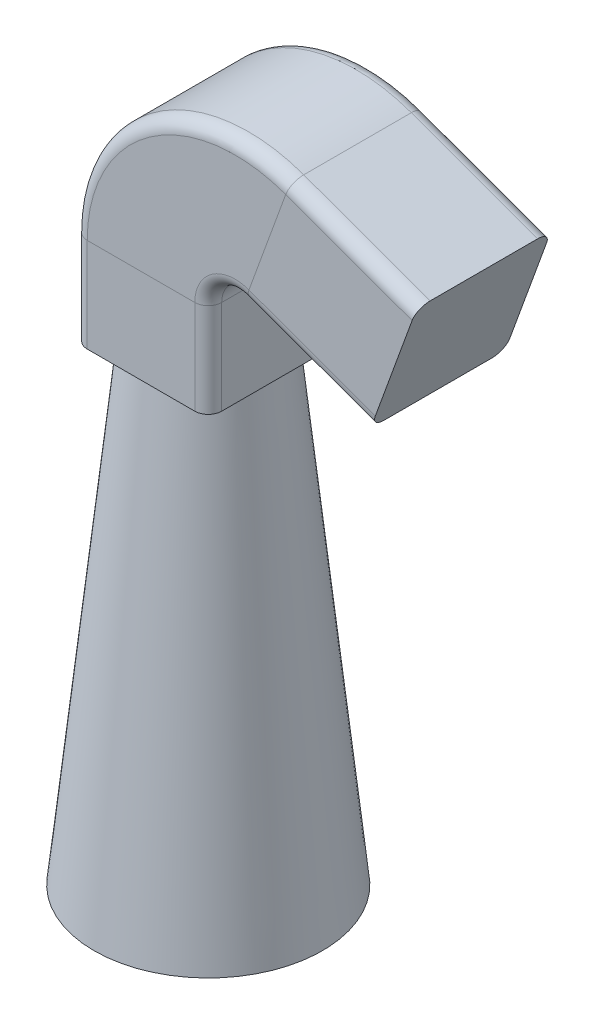
ISO-10303-21;
HEADER;
FILE_DESCRIPTION(('STEP AP214'),'2;1');
FILE_NAME('part.step','',(''),(''),'','','');
FILE_SCHEMA(('AUTOMOTIVE_DESIGN { 1 0 10303 214 1 1 1 1 }'));
ENDSEC;
DATA;
#1=APPLICATION_CONTEXT('core data for automotive mechanical design processes');
#2=APPLICATION_PROTOCOL_DEFINITION('international standard','automotive_design',2000,#1);
#3=PRODUCT_CONTEXT('',#1,'mechanical');
#4=PRODUCT('Part','Part','',(#3));
#5=PRODUCT_RELATED_PRODUCT_CATEGORY('part','',(#4));
#6=PRODUCT_DEFINITION_FORMATION('','',#4);
#7=PRODUCT_DEFINITION_CONTEXT('part definition',#1,'design');
#8=PRODUCT_DEFINITION('design','',#6,#7);
#9=PRODUCT_DEFINITION_SHAPE('','',#8);
#10=(LENGTH_UNIT() NAMED_UNIT(*) SI_UNIT(.MILLI.,.METRE.));
#11=(NAMED_UNIT(*) PLANE_ANGLE_UNIT() SI_UNIT($,.RADIAN.));
#12=(NAMED_UNIT(*) SI_UNIT($,.STERADIAN.) SOLID_ANGLE_UNIT());
#13=UNCERTAINTY_MEASURE_WITH_UNIT(LENGTH_MEASURE(1.E-05),#10,'distance_accuracy_value','');
#14=(GEOMETRIC_REPRESENTATION_CONTEXT(3) GLOBAL_UNCERTAINTY_ASSIGNED_CONTEXT((#13)) GLOBAL_UNIT_ASSIGNED_CONTEXT((#10,
#11,#12)) REPRESENTATION_CONTEXT('',''));
#15=CARTESIAN_POINT('',(0.,0.,0.));
#16=DIRECTION('',(0.,0.,1.));
#17=DIRECTION('',(1.,0.,0.));
#18=AXIS2_PLACEMENT_3D('',#15,#16,#17);
#19=CARTESIAN_POINT('',(0.,0.,0.));
#20=DIRECTION('',(0.,1.,0.));
#21=DIRECTION('',(0.,0.,1.));
#22=AXIS2_PLACEMENT_3D('',#19,#20,#21);
#23=PLANE('',#22);
#24=CARTESIAN_POINT('',(0.,0.,0.));
#25=DIRECTION('',(0.,1.,0.));
#26=DIRECTION('',(0.,0.,1.));
#27=AXIS2_PLACEMENT_3D('',#24,#25,#26);
#28=CIRCLE('',#27,8.5);
#29=CARTESIAN_POINT('',(0.,0.,8.5));
#30=VERTEX_POINT('',#29);
#31=EDGE_CURVE('E200',#30,#30,#28,.T.);
#32=ORIENTED_EDGE('',*,*,#31,.F.);
#33=EDGE_LOOP('',(#32));
#34=FACE_BOUND('',#33,.T.);
#35=ADVANCED_FACE('F44',(#34),#23,.F.);
#36=CARTESIAN_POINT('',(0.,0.,0.));
#37=DIRECTION('',(0.,-1.,0.));
#38=DIRECTION('',(0.,0.,-1.));
#39=AXIS2_PLACEMENT_3D('',#36,#37,#38);
#40=CONICAL_SURFACE('',#39,8.5,0.104719755119653);
#41=CARTESIAN_POINT('',(0.,35.,0.));
#42=DIRECTION('',(0.,1.,0.));
#43=DIRECTION('',(0.,0.,1.));
#44=AXIS2_PLACEMENT_3D('',#41,#42,#43);
#45=CIRCLE('',#44,4.82135176570156);
#46=CARTESIAN_POINT('',(0.,35.,4.82135176570156));
#47=VERTEX_POINT('',#46);
#48=EDGE_CURVE('E345',#47,#47,#45,.T.);
#49=ORIENTED_EDGE('',*,*,#48,.F.);
#50=EDGE_LOOP('',(#49));
#51=FACE_BOUND('',#50,.T.);
#52=ORIENTED_EDGE('',*,*,#31,.T.);
#53=EDGE_LOOP('',(#52));
#54=FACE_BOUND('',#53,.T.);
#55=ADVANCED_FACE('F457',(#51,#54),#40,.T.);
#56=CARTESIAN_POINT('',(48.8640162808672,35.,0.));
#57=DIRECTION('',(0.,1.,0.));
#58=DIRECTION('',(-1.,0.,0.));
#59=AXIS2_PLACEMENT_3D('',#56,#57,#58);
#60=PLANE('',#59);
#61=ORIENTED_EDGE('',*,*,#48,.T.);
#62=EDGE_LOOP('',(#61));
#63=FACE_BOUND('',#62,.T.);
#64=DIRECTION('',(0.,0.,-1.));
#65=VECTOR('',#64,1.);
#66=CARTESIAN_POINT('',(5.,35.,5.));
#67=LINE('',#66,#65);
#68=CARTESIAN_POINT('',(5.,35.,4.));
#69=VERTEX_POINT('',#68);
#70=CARTESIAN_POINT('',(5.,35.,-4.));
#71=VERTEX_POINT('',#70);
#72=EDGE_CURVE('E289',#69,#71,#67,.T.);
#73=ORIENTED_EDGE('',*,*,#72,.F.);
#74=CARTESIAN_POINT('',(4.,35.,4.));
#75=DIRECTION('',(0.,1.,0.));
#76=DIRECTION('',(-1.,0.,0.));
#77=AXIS2_PLACEMENT_3D('',#74,#75,#76);
#78=CIRCLE('',#77,1.);
#79=CARTESIAN_POINT('',(4.,35.,5.));
#80=VERTEX_POINT('',#79);
#81=EDGE_CURVE('E54',#69,#80,#78,.F.);
#82=ORIENTED_EDGE('',*,*,#81,.T.);
#83=DIRECTION('',(1.,0.,0.));
#84=VECTOR('',#83,1.);
#85=CARTESIAN_POINT('',(5.,35.,5.));
#86=LINE('',#85,#84);
#87=CARTESIAN_POINT('',(-4.,35.,5.));
#88=VERTEX_POINT('',#87);
#89=EDGE_CURVE('E296',#88,#80,#86,.T.);
#90=ORIENTED_EDGE('',*,*,#89,.F.);
#91=CARTESIAN_POINT('',(-4.,35.,4.));
#92=DIRECTION('',(0.,1.,0.));
#93=DIRECTION('',(-1.,0.,0.));
#94=AXIS2_PLACEMENT_3D('',#91,#92,#93);
#95=CIRCLE('',#94,1.);
#96=CARTESIAN_POINT('',(-5.,35.,4.));
#97=VERTEX_POINT('',#96);
#98=EDGE_CURVE('E358',#88,#97,#95,.F.);
#99=ORIENTED_EDGE('',*,*,#98,.T.);
#100=DIRECTION('',(0.,0.,1.));
#101=VECTOR('',#100,1.);
#102=CARTESIAN_POINT('',(-5.,35.,5.));
#103=LINE('',#102,#101);
#104=CARTESIAN_POINT('',(-5.,35.,-4.));
#105=VERTEX_POINT('',#104);
#106=EDGE_CURVE('E301',#105,#97,#103,.T.);
#107=ORIENTED_EDGE('',*,*,#106,.F.);
#108=CARTESIAN_POINT('',(-4.,35.,-4.));
#109=DIRECTION('',(0.,1.,0.));
#110=DIRECTION('',(-1.,0.,0.));
#111=AXIS2_PLACEMENT_3D('',#108,#109,#110);
#112=CIRCLE('',#111,1.);
#113=CARTESIAN_POINT('',(-4.,35.,-5.));
#114=VERTEX_POINT('',#113);
#115=EDGE_CURVE('E197',#105,#114,#112,.F.);
#116=ORIENTED_EDGE('',*,*,#115,.T.);
#117=DIRECTION('',(-1.,0.,0.));
#118=VECTOR('',#117,1.);
#119=CARTESIAN_POINT('',(5.,35.,-5.));
#120=LINE('',#119,#118);
#121=CARTESIAN_POINT('',(4.,35.,-5.));
#122=VERTEX_POINT('',#121);
#123=EDGE_CURVE('E320',#122,#114,#120,.T.);
#124=ORIENTED_EDGE('',*,*,#123,.F.);
#125=CARTESIAN_POINT('',(4.,35.,-4.));
#126=DIRECTION('',(0.,1.,0.));
#127=DIRECTION('',(-1.,0.,0.));
#128=AXIS2_PLACEMENT_3D('',#125,#126,#127);
#129=CIRCLE('',#128,1.);
#130=EDGE_CURVE('E66',#122,#71,#129,.F.);
#131=ORIENTED_EDGE('',*,*,#130,.T.);
#132=EDGE_LOOP('',(#73,#82,#90,#99,#107,#116,#124,#131));
#133=FACE_BOUND('',#132,.T.);
#134=ADVANCED_FACE('F419',(#63,#133),#60,.F.);
#135=CARTESIAN_POINT('',(2.08137456386793,-0.757558387606738,0.));
#136=DIRECTION('',(0.939692620785907,-0.342020143325673,0.));
#137=DIRECTION('',(0.342020143325673,0.939692620785907,0.));
#138=AXIS2_PLACEMENT_3D('',#135,#136,#137);
#139=PLANE('',#138);
#140=DIRECTION('',(-0.342020143325673,-0.939692620785907,0.));
#141=VECTOR('',#140,1.);
#142=CARTESIAN_POINT('',(17.0837516990898,40.461134029557,5.));
#143=LINE('',#142,#141);
#144=CARTESIAN_POINT('',(20.1619329890208,48.9183676166302,5.));
#145=VERTEX_POINT('',#144);
#146=CARTESIAN_POINT('',(17.4257718424155,41.4008266503429,5.));
#147=VERTEX_POINT('',#146);
#148=EDGE_CURVE('E332',#145,#147,#143,.T.);
#149=ORIENTED_EDGE('',*,*,#148,.T.);
#150=CARTESIAN_POINT('',(17.4257718424155,41.4008266503429,4.));
#151=DIRECTION('',(0.939692620785907,-0.342020143325673,0.));
#152=DIRECTION('',(0.342020143325673,0.939692620785907,0.));
#153=AXIS2_PLACEMENT_3D('',#150,#151,#152);
#154=CIRCLE('',#153,1.);
#155=CARTESIAN_POINT('',(17.0837516990898,40.461134029557,4.));
#156=VERTEX_POINT('',#155);
#157=EDGE_CURVE('E230',#147,#156,#154,.T.);
#158=ORIENTED_EDGE('',*,*,#157,.T.);
#159=DIRECTION('',(0.,0.,-1.));
#160=VECTOR('',#159,1.);
#161=CARTESIAN_POINT('',(17.0837516990898,40.461134029557,5.));
#162=LINE('',#161,#160);
#163=CARTESIAN_POINT('',(17.0837516990898,40.461134029557,-4.));
#164=VERTEX_POINT('',#163);
#165=EDGE_CURVE('E313',#156,#164,#162,.T.);
#166=ORIENTED_EDGE('',*,*,#165,.T.);
#167=CARTESIAN_POINT('',(17.4257718424155,41.4008266503429,-4.));
#168=DIRECTION('',(0.939692620785907,-0.342020143325673,0.));
#169=DIRECTION('',(0.342020143325673,0.939692620785907,0.));
#170=AXIS2_PLACEMENT_3D('',#167,#168,#169);
#171=CIRCLE('',#170,1.);
#172=CARTESIAN_POINT('',(17.4257718424155,41.4008266503429,-5.));
#173=VERTEX_POINT('',#172);
#174=EDGE_CURVE('E221',#164,#173,#171,.T.);
#175=ORIENTED_EDGE('',*,*,#174,.T.);
#176=DIRECTION('',(0.342020143325673,0.939692620785907,0.));
#177=VECTOR('',#176,1.);
#178=CARTESIAN_POINT('',(17.0837516990898,40.461134029557,-5.));
#179=LINE('',#178,#177);
#180=CARTESIAN_POINT('',(20.1619329890208,48.9183676166302,-5.));
#181=VERTEX_POINT('',#180);
#182=EDGE_CURVE('E312',#173,#181,#179,.T.);
#183=ORIENTED_EDGE('',*,*,#182,.T.);
#184=CARTESIAN_POINT('',(20.1619329890208,48.9183676166302,-4.));
#185=DIRECTION('',(0.939692620785907,-0.342020143325673,0.));
#186=DIRECTION('',(0.342020143325673,0.939692620785907,0.));
#187=AXIS2_PLACEMENT_3D('',#184,#185,#186);
#188=CIRCLE('',#187,1.);
#189=CARTESIAN_POINT('',(20.5039531323465,49.8580602374161,-4.));
#190=VERTEX_POINT('',#189);
#191=EDGE_CURVE('E364',#181,#190,#188,.T.);
#192=ORIENTED_EDGE('',*,*,#191,.T.);
#193=DIRECTION('',(0.,0.,1.));
#194=VECTOR('',#193,1.);
#195=CARTESIAN_POINT('',(20.5039531323465,49.8580602374161,5.));
#196=LINE('',#195,#194);
#197=CARTESIAN_POINT('',(20.5039531323465,49.8580602374161,4.));
#198=VERTEX_POINT('',#197);
#199=EDGE_CURVE('E322',#190,#198,#196,.T.);
#200=ORIENTED_EDGE('',*,*,#199,.T.);
#201=CARTESIAN_POINT('',(20.1619329890208,48.9183676166302,4.));
#202=DIRECTION('',(0.939692620785907,-0.342020143325673,0.));
#203=DIRECTION('',(0.342020143325673,0.939692620785907,0.));
#204=AXIS2_PLACEMENT_3D('',#201,#202,#203);
#205=CIRCLE('',#204,1.);
#206=EDGE_CURVE('E366',#198,#145,#205,.T.);
#207=ORIENTED_EDGE('',*,*,#206,.T.);
#208=EDGE_LOOP('',(#149,#158,#166,#175,#183,#192,#200,#207));
#209=FACE_BOUND('',#208,.T.);
#210=ADVANCED_FACE('F406',(#209),#139,.T.);
#211=CARTESIAN_POINT('',(5.,35.,5.));
#212=DIRECTION('',(1.,0.,0.));
#213=DIRECTION('',(0.,0.,-1.));
#214=AXIS2_PLACEMENT_3D('',#211,#212,#213);
#215=PLANE('',#214);
#216=DIRECTION('',(0.,0.,-1.));
#217=VECTOR('',#216,1.);
#218=CARTESIAN_POINT('',(5.,42.0029639528051,5.));
#219=LINE('',#218,#217);
#220=CARTESIAN_POINT('',(5.,42.0029639528051,4.));
#221=VERTEX_POINT('',#220);
#222=CARTESIAN_POINT('',(5.,42.0029639528051,-4.));
#223=VERTEX_POINT('',#222);
#224=EDGE_CURVE('E286',#221,#223,#219,.T.);
#225=ORIENTED_EDGE('',*,*,#224,.F.);
#226=DIRECTION('',(0.,1.,0.));
#227=VECTOR('',#226,1.);
#228=CARTESIAN_POINT('',(5.,35.,4.));
#229=LINE('',#228,#227);
#230=EDGE_CURVE('E259',#221,#69,#229,.F.);
#231=ORIENTED_EDGE('',*,*,#230,.T.);
#232=ORIENTED_EDGE('',*,*,#72,.T.);
#233=DIRECTION('',(0.,1.,0.));
#234=VECTOR('',#233,1.);
#235=CARTESIAN_POINT('',(5.,35.,-4.));
#236=LINE('',#235,#234);
#237=EDGE_CURVE('E258',#71,#223,#236,.T.);
#238=ORIENTED_EDGE('',*,*,#237,.T.);
#239=EDGE_LOOP('',(#225,#231,#232,#238));
#240=FACE_BOUND('',#239,.T.);
#241=ADVANCED_FACE('F290',(#240),#215,.T.);
#242=CARTESIAN_POINT('',(5.,35.,-5.));
#243=DIRECTION('',(0.,0.,-1.));
#244=DIRECTION('',(-1.,0.,0.));
#245=AXIS2_PLACEMENT_3D('',#242,#243,#244);
#246=PLANE('',#245);
#247=DIRECTION('',(-1.,0.,0.));
#248=VECTOR('',#247,1.);
#249=CARTESIAN_POINT('',(5.,42.0029639528051,-5.));
#250=LINE('',#249,#248);
#251=CARTESIAN_POINT('',(4.,42.0029639528051,-5.));
#252=VERTEX_POINT('',#251);
#253=CARTESIAN_POINT('',(-4.,42.0029639528051,-5.));
#254=VERTEX_POINT('',#253);
#255=EDGE_CURVE('E186',#252,#254,#250,.T.);
#256=ORIENTED_EDGE('',*,*,#255,.F.);
#257=DIRECTION('',(0.,1.,0.));
#258=VECTOR('',#257,1.);
#259=CARTESIAN_POINT('',(4.,35.,-5.));
#260=LINE('',#259,#258);
#261=EDGE_CURVE('E11',#252,#122,#260,.F.);
#262=ORIENTED_EDGE('',*,*,#261,.T.);
#263=ORIENTED_EDGE('',*,*,#123,.T.);
#264=DIRECTION('',(0.,1.,0.));
#265=VECTOR('',#264,1.);
#266=CARTESIAN_POINT('',(-4.,35.,-5.));
#267=LINE('',#266,#265);
#268=EDGE_CURVE('E372',#114,#254,#267,.T.);
#269=ORIENTED_EDGE('',*,*,#268,.T.);
#270=EDGE_LOOP('',(#256,#262,#263,#269));
#271=FACE_BOUND('',#270,.T.);
#272=ADVANCED_FACE('F420',(#271),#246,.T.);
#273=CARTESIAN_POINT('',(-5.,35.,5.));
#274=DIRECTION('',(-1.,0.,0.));
#275=DIRECTION('',(0.,0.,1.));
#276=AXIS2_PLACEMENT_3D('',#273,#274,#275);
#277=PLANE('',#276);
#278=ORIENTED_EDGE('',*,*,#106,.T.);
#279=DIRECTION('',(0.,1.,0.));
#280=VECTOR('',#279,1.);
#281=CARTESIAN_POINT('',(-5.,35.,4.));
#282=LINE('',#281,#280);
#283=CARTESIAN_POINT('',(-5.,42.0029639528051,4.));
#284=VERTEX_POINT('',#283);
#285=EDGE_CURVE('E184',#97,#284,#282,.T.);
#286=ORIENTED_EDGE('',*,*,#285,.T.);
#287=DIRECTION('',(0.,0.,1.));
#288=VECTOR('',#287,1.);
#289=CARTESIAN_POINT('',(-5.,42.0029639528051,5.));
#290=LINE('',#289,#288);
#291=CARTESIAN_POINT('',(-5.,42.0029639528051,-4.));
#292=VERTEX_POINT('',#291);
#293=EDGE_CURVE('E164',#292,#284,#290,.T.);
#294=ORIENTED_EDGE('',*,*,#293,.F.);
#295=DIRECTION('',(0.,1.,0.));
#296=VECTOR('',#295,1.);
#297=CARTESIAN_POINT('',(-5.,35.,-4.));
#298=LINE('',#297,#296);
#299=EDGE_CURVE('E182',#292,#105,#298,.F.);
#300=ORIENTED_EDGE('',*,*,#299,.T.);
#301=EDGE_LOOP('',(#278,#286,#294,#300));
#302=FACE_BOUND('',#301,.T.);
#303=ADVANCED_FACE('F179',(#302),#277,.T.);
#304=CARTESIAN_POINT('',(5.,35.,5.));
#305=DIRECTION('',(0.,0.,1.));
#306=DIRECTION('',(1.,0.,0.));
#307=AXIS2_PLACEMENT_3D('',#304,#305,#306);
#308=PLANE('',#307);
#309=ORIENTED_EDGE('',*,*,#89,.T.);
#310=DIRECTION('',(0.,1.,0.));
#311=VECTOR('',#310,1.);
#312=CARTESIAN_POINT('',(4.,35.,5.));
#313=LINE('',#312,#311);
#314=CARTESIAN_POINT('',(4.,42.0029639528051,5.));
#315=VERTEX_POINT('',#314);
#316=EDGE_CURVE('E251',#80,#315,#313,.T.);
#317=ORIENTED_EDGE('',*,*,#316,.T.);
#318=DIRECTION('',(1.,0.,0.));
#319=VECTOR('',#318,1.);
#320=CARTESIAN_POINT('',(5.,42.0029639528051,5.));
#321=LINE('',#320,#319);
#322=CARTESIAN_POINT('',(-4.,42.0029639528051,5.));
#323=VERTEX_POINT('',#322);
#324=EDGE_CURVE('E189',#323,#315,#321,.T.);
#325=ORIENTED_EDGE('',*,*,#324,.F.);
#326=DIRECTION('',(0.,1.,0.));
#327=VECTOR('',#326,1.);
#328=CARTESIAN_POINT('',(-4.,35.,5.));
#329=LINE('',#328,#327);
#330=EDGE_CURVE('E354',#323,#88,#329,.F.);
#331=ORIENTED_EDGE('',*,*,#330,.T.);
#332=EDGE_LOOP('',(#309,#317,#325,#331));
#333=FACE_BOUND('',#332,.T.);
#334=ADVANCED_FACE('F426',(#333),#308,.T.);
#335=CARTESIAN_POINT('',(7.,42.0029639528052,0.));
#336=DIRECTION('',(0.,0.,-1.));
#337=DIRECTION('',(-1.,0.,0.));
#338=AXIS2_PLACEMENT_3D('',#335,#336,#337);
#339=CYLINDRICAL_SURFACE('',#338,2.);
#340=DIRECTION('',(0.,0.,-1.));
#341=VECTOR('',#340,1.);
#342=CARTESIAN_POINT('',(7.68404028665096,43.8823491943771,5.));
#343=LINE('',#342,#341);
#344=CARTESIAN_POINT('',(7.68404028665096,43.8823491943771,4.));
#345=VERTEX_POINT('',#344);
#346=CARTESIAN_POINT('',(7.68404028665096,43.8823491943771,-4.));
#347=VERTEX_POINT('',#346);
#348=EDGE_CURVE('E307',#345,#347,#343,.T.);
#349=ORIENTED_EDGE('',*,*,#348,.F.);
#350=CARTESIAN_POINT('',(7.,42.0029639528052,4.));
#351=DIRECTION('',(0.,0.,1.));
#352=DIRECTION('',(1.,0.,0.));
#353=AXIS2_PLACEMENT_3D('',#350,#351,#352);
#354=CIRCLE('',#353,2.);
#355=EDGE_CURVE('E243',#345,#221,#354,.T.);
#356=ORIENTED_EDGE('',*,*,#355,.T.);
#357=ORIENTED_EDGE('',*,*,#224,.T.);
#358=CARTESIAN_POINT('',(7.,42.0029639528052,-4.));
#359=DIRECTION('',(0.,0.,-1.));
#360=DIRECTION('',(-1.,0.,0.));
#361=AXIS2_PLACEMENT_3D('',#358,#359,#360);
#362=CIRCLE('',#361,2.);
#363=EDGE_CURVE('E244',#223,#347,#362,.T.);
#364=ORIENTED_EDGE('',*,*,#363,.T.);
#365=EDGE_LOOP('',(#349,#356,#357,#364));
#366=FACE_BOUND('',#365,.T.);
#367=ADVANCED_FACE('F291',(#366),#339,.F.);
#368=CARTESIAN_POINT('',(5.,42.0029639528051,-5.));
#369=DIRECTION('',(0.,0.,-1.));
#370=DIRECTION('',(-1.,0.,0.));
#371=AXIS2_PLACEMENT_3D('',#368,#369,#370);
#372=PLANE('',#371);
#373=DIRECTION('',(0.342020143325673,0.939692620785907,0.));
#374=VECTOR('',#373,1.);
#375=CARTESIAN_POINT('',(7.68404028665096,43.8823491943771,-5.));
#376=LINE('',#375,#374);
#377=CARTESIAN_POINT('',(8.02606042997662,44.822041815163,-5.));
#378=VERTEX_POINT('',#377);
#379=CARTESIAN_POINT('',(10.762221576582,52.3395827814503,-5.));
#380=VERTEX_POINT('',#379);
#381=EDGE_CURVE('E309',#378,#380,#376,.T.);
#382=ORIENTED_EDGE('',*,*,#381,.F.);
#383=CARTESIAN_POINT('',(7.,42.0029639528052,-5.));
#384=DIRECTION('',(0.,0.,-1.));
#385=DIRECTION('',(-1.,0.,0.));
#386=AXIS2_PLACEMENT_3D('',#383,#384,#385);
#387=CIRCLE('',#386,3.);
#388=EDGE_CURVE('E249',#378,#252,#387,.F.);
#389=ORIENTED_EDGE('',*,*,#388,.T.);
#390=ORIENTED_EDGE('',*,*,#255,.T.);
#391=CARTESIAN_POINT('',(7.,42.0029639528052,-5.));
#392=DIRECTION('',(0.,0.,-1.));
#393=DIRECTION('',(-1.,0.,0.));
#394=AXIS2_PLACEMENT_3D('',#391,#392,#393);
#395=CIRCLE('',#394,11.);
#396=EDGE_CURVE('E201',#254,#380,#395,.T.);
#397=ORIENTED_EDGE('',*,*,#396,.T.);
#398=EDGE_LOOP('',(#382,#389,#390,#397));
#399=FACE_BOUND('',#398,.T.);
#400=ADVANCED_FACE('F416',(#399),#372,.T.);
#401=CARTESIAN_POINT('',(7.,42.0029639528052,0.));
#402=DIRECTION('',(0.,0.,-1.));
#403=DIRECTION('',(-1.,0.,0.));
#404=AXIS2_PLACEMENT_3D('',#401,#402,#403);
#405=CYLINDRICAL_SURFACE('',#404,12.);
#406=DIRECTION('',(0.,0.,1.));
#407=VECTOR('',#406,1.);
#408=CARTESIAN_POINT('',(11.1042417199077,53.2792754022362,5.));
#409=LINE('',#408,#407);
#410=CARTESIAN_POINT('',(11.1042417199077,53.2792754022362,-4.));
#411=VERTEX_POINT('',#410);
#412=CARTESIAN_POINT('',(11.1042417199077,53.2792754022362,4.));
#413=VERTEX_POINT('',#412);
#414=EDGE_CURVE('E170',#411,#413,#409,.T.);
#415=ORIENTED_EDGE('',*,*,#414,.F.);
#416=CARTESIAN_POINT('',(7.,42.0029639528052,-4.));
#417=DIRECTION('',(0.,0.,-1.));
#418=DIRECTION('',(-1.,0.,0.));
#419=AXIS2_PLACEMENT_3D('',#416,#417,#418);
#420=CIRCLE('',#419,12.);
#421=EDGE_CURVE('E165',#411,#292,#420,.F.);
#422=ORIENTED_EDGE('',*,*,#421,.T.);
#423=ORIENTED_EDGE('',*,*,#293,.T.);
#424=CARTESIAN_POINT('',(7.,42.0029639528052,4.));
#425=DIRECTION('',(0.,0.,1.));
#426=DIRECTION('',(1.,0.,0.));
#427=AXIS2_PLACEMENT_3D('',#424,#425,#426);
#428=CIRCLE('',#427,12.);
#429=EDGE_CURVE('E173',#284,#413,#428,.F.);
#430=ORIENTED_EDGE('',*,*,#429,.T.);
#431=EDGE_LOOP('',(#415,#422,#423,#430));
#432=FACE_BOUND('',#431,.T.);
#433=ADVANCED_FACE('F163',(#432),#405,.T.);
#434=CARTESIAN_POINT('',(5.,42.0029639528051,5.));
#435=DIRECTION('',(0.,0.,1.));
#436=DIRECTION('',(1.,0.,0.));
#437=AXIS2_PLACEMENT_3D('',#434,#435,#436);
#438=PLANE('',#437);
#439=ORIENTED_EDGE('',*,*,#324,.T.);
#440=CARTESIAN_POINT('',(7.,42.0029639528052,5.));
#441=DIRECTION('',(0.,0.,1.));
#442=DIRECTION('',(1.,0.,0.));
#443=AXIS2_PLACEMENT_3D('',#440,#441,#442);
#444=CIRCLE('',#443,3.);
#445=CARTESIAN_POINT('',(8.02606042997662,44.822041815163,5.));
#446=VERTEX_POINT('',#445);
#447=EDGE_CURVE('E236',#315,#446,#444,.F.);
#448=ORIENTED_EDGE('',*,*,#447,.T.);
#449=DIRECTION('',(-0.342020143325673,-0.939692620785907,0.));
#450=VECTOR('',#449,1.);
#451=CARTESIAN_POINT('',(7.68404028665096,43.8823491943771,5.));
#452=LINE('',#451,#450);
#453=CARTESIAN_POINT('',(10.762221576582,52.3395827814503,5.));
#454=VERTEX_POINT('',#453);
#455=EDGE_CURVE('E316',#454,#446,#452,.T.);
#456=ORIENTED_EDGE('',*,*,#455,.F.);
#457=CARTESIAN_POINT('',(7.,42.0029639528052,5.));
#458=DIRECTION('',(0.,0.,1.));
#459=DIRECTION('',(1.,0.,0.));
#460=AXIS2_PLACEMENT_3D('',#457,#458,#459);
#461=CIRCLE('',#460,11.);
#462=EDGE_CURVE('E175',#454,#323,#461,.T.);
#463=ORIENTED_EDGE('',*,*,#462,.T.);
#464=EDGE_LOOP('',(#439,#448,#456,#463));
#465=FACE_BOUND('',#464,.T.);
#466=ADVANCED_FACE('F432',(#465),#438,.T.);
#467=CARTESIAN_POINT('',(7.68404028665141,43.8823491943769,5.));
#468=DIRECTION('',(-0.342020143325673,-0.939692620785907,0.));
#469=DIRECTION('',(0.939692620785907,-0.342020143325673,0.));
#470=AXIS2_PLACEMENT_3D('',#467,#468,#469);
#471=PLANE('',#470);
#472=ORIENTED_EDGE('',*,*,#165,.F.);
#473=DIRECTION('',(0.939692620785907,-0.342020143325673,0.));
#474=VECTOR('',#473,1.);
#475=CARTESIAN_POINT('',(7.68404028665141,43.8823491943769,4.));
#476=LINE('',#475,#474);
#477=EDGE_CURVE('E234',#156,#345,#476,.F.);
#478=ORIENTED_EDGE('',*,*,#477,.T.);
#479=ORIENTED_EDGE('',*,*,#348,.T.);
#480=DIRECTION('',(0.939692620785907,-0.342020143325673,0.));
#481=VECTOR('',#480,1.);
#482=CARTESIAN_POINT('',(7.68404028665141,43.8823491943769,-4.));
#483=LINE('',#482,#481);
#484=EDGE_CURVE('E233',#347,#164,#483,.T.);
#485=ORIENTED_EDGE('',*,*,#484,.T.);
#486=EDGE_LOOP('',(#472,#478,#479,#485));
#487=FACE_BOUND('',#486,.T.);
#488=ADVANCED_FACE('F446',(#487),#471,.T.);
#489=CARTESIAN_POINT('',(7.68404028665141,43.8823491943769,-5.));
#490=DIRECTION('',(0.,0.,-1.));
#491=DIRECTION('',(-1.,0.,0.));
#492=AXIS2_PLACEMENT_3D('',#489,#490,#491);
#493=PLANE('',#492);
#494=ORIENTED_EDGE('',*,*,#182,.F.);
#495=DIRECTION('',(0.939692620785907,-0.342020143325673,0.));
#496=VECTOR('',#495,1.);
#497=CARTESIAN_POINT('',(8.02606042997709,44.8220418151629,-5.));
#498=LINE('',#497,#496);
#499=EDGE_CURVE('E250',#173,#378,#498,.F.);
#500=ORIENTED_EDGE('',*,*,#499,.T.);
#501=ORIENTED_EDGE('',*,*,#381,.T.);
#502=DIRECTION('',(0.939692620785907,-0.342020143325673,0.));
#503=VECTOR('',#502,1.);
#504=CARTESIAN_POINT('',(10.7622215765825,52.3395827814501,-5.));
#505=LINE('',#504,#503);
#506=EDGE_CURVE('E223',#380,#181,#505,.T.);
#507=ORIENTED_EDGE('',*,*,#506,.T.);
#508=EDGE_LOOP('',(#494,#500,#501,#507));
#509=FACE_BOUND('',#508,.T.);
#510=ADVANCED_FACE('F414',(#509),#493,.T.);
#511=CARTESIAN_POINT('',(11.1042417199081,53.279275402236,5.));
#512=DIRECTION('',(0.342020143325673,0.939692620785907,0.));
#513=DIRECTION('',(-0.939692620785907,0.342020143325673,0.));
#514=AXIS2_PLACEMENT_3D('',#511,#512,#513);
#515=PLANE('',#514);
#516=ORIENTED_EDGE('',*,*,#414,.T.);
#517=DIRECTION('',(0.939692620785907,-0.342020143325673,0.));
#518=VECTOR('',#517,1.);
#519=CARTESIAN_POINT('',(11.1042417199081,53.279275402236,4.));
#520=LINE('',#519,#518);
#521=EDGE_CURVE('E362',#413,#198,#520,.T.);
#522=ORIENTED_EDGE('',*,*,#521,.T.);
#523=ORIENTED_EDGE('',*,*,#199,.F.);
#524=DIRECTION('',(0.939692620785907,-0.342020143325673,0.));
#525=VECTOR('',#524,1.);
#526=CARTESIAN_POINT('',(11.1042417199081,53.279275402236,-4.));
#527=LINE('',#526,#525);
#528=EDGE_CURVE('E357',#190,#411,#527,.F.);
#529=ORIENTED_EDGE('',*,*,#528,.T.);
#530=EDGE_LOOP('',(#516,#522,#523,#529));
#531=FACE_BOUND('',#530,.T.);
#532=ADVANCED_FACE('F404',(#531),#515,.T.);
#533=CARTESIAN_POINT('',(7.68404028665141,43.8823491943769,5.));
#534=DIRECTION('',(0.,0.,1.));
#535=DIRECTION('',(0.,-1.,0.));
#536=AXIS2_PLACEMENT_3D('',#533,#534,#535);
#537=PLANE('',#536);
#538=ORIENTED_EDGE('',*,*,#455,.T.);
#539=DIRECTION('',(0.939692620785907,-0.342020143325673,0.));
#540=VECTOR('',#539,1.);
#541=CARTESIAN_POINT('',(8.02606042997709,44.8220418151629,5.));
#542=LINE('',#541,#540);
#543=EDGE_CURVE('E219',#446,#147,#542,.T.);
#544=ORIENTED_EDGE('',*,*,#543,.T.);
#545=ORIENTED_EDGE('',*,*,#148,.F.);
#546=DIRECTION('',(0.939692620785907,-0.342020143325673,0.));
#547=VECTOR('',#546,1.);
#548=CARTESIAN_POINT('',(10.7622215765825,52.3395827814501,5.));
#549=LINE('',#548,#547);
#550=EDGE_CURVE('E371',#145,#454,#549,.F.);
#551=ORIENTED_EDGE('',*,*,#550,.T.);
#552=EDGE_LOOP('',(#538,#544,#545,#551));
#553=FACE_BOUND('',#552,.T.);
#554=ADVANCED_FACE('F437',(#553),#537,.T.);
#555=CARTESIAN_POINT('',(10.7622215765825,52.3395827814501,4.));
#556=DIRECTION('',(0.939692620785907,-0.342020143325673,0.));
#557=DIRECTION('',(0.342020143325673,0.939692620785907,0.));
#558=AXIS2_PLACEMENT_3D('',#555,#556,#557);
#559=CYLINDRICAL_SURFACE('',#558,1.);
#560=ORIENTED_EDGE('',*,*,#206,.F.);
#561=ORIENTED_EDGE('',*,*,#521,.F.);
#562=CARTESIAN_POINT('',(10.762221576582,52.3395827814503,4.));
#563=DIRECTION('',(-0.939692620785907,0.342020143325674,0.));
#564=DIRECTION('',(-0.342020143325674,-0.939692620785907,0.));
#565=AXIS2_PLACEMENT_3D('',#562,#563,#564);
#566=CIRCLE('',#565,1.);
#567=EDGE_CURVE('E220',#454,#413,#566,.T.);
#568=ORIENTED_EDGE('',*,*,#567,.F.);
#569=ORIENTED_EDGE('',*,*,#550,.F.);
#570=EDGE_LOOP('',(#560,#561,#568,#569));
#571=FACE_BOUND('',#570,.T.);
#572=ADVANCED_FACE('F402',(#571),#559,.T.);
#573=CARTESIAN_POINT('',(7.,42.0029639528052,4.));
#574=DIRECTION('',(0.,0.,1.));
#575=DIRECTION('',(1.,0.,0.));
#576=AXIS2_PLACEMENT_3D('',#573,#574,#575);
#577=TOROIDAL_SURFACE('',#576,11.,1.);
#578=ORIENTED_EDGE('',*,*,#567,.T.);
#579=ORIENTED_EDGE('',*,*,#429,.F.);
#580=CARTESIAN_POINT('',(-4.,42.0029639528051,4.));
#581=DIRECTION('',(0.,-1.,0.));
#582=DIRECTION('',(0.,0.,-1.));
#583=AXIS2_PLACEMENT_3D('',#580,#581,#582);
#584=CIRCLE('',#583,1.);
#585=EDGE_CURVE('E211',#323,#284,#584,.T.);
#586=ORIENTED_EDGE('',*,*,#585,.F.);
#587=ORIENTED_EDGE('',*,*,#462,.F.);
#588=EDGE_LOOP('',(#578,#579,#586,#587));
#589=FACE_BOUND('',#588,.T.);
#590=ADVANCED_FACE('F398',(#589),#577,.T.);
#591=CARTESIAN_POINT('',(-4.,35.,4.));
#592=DIRECTION('',(0.,1.,0.));
#593=DIRECTION('',(0.,0.,1.));
#594=AXIS2_PLACEMENT_3D('',#591,#592,#593);
#595=CYLINDRICAL_SURFACE('',#594,1.);
#596=ORIENTED_EDGE('',*,*,#98,.F.);
#597=ORIENTED_EDGE('',*,*,#330,.F.);
#598=ORIENTED_EDGE('',*,*,#585,.T.);
#599=ORIENTED_EDGE('',*,*,#285,.F.);
#600=EDGE_LOOP('',(#596,#597,#598,#599));
#601=FACE_BOUND('',#600,.T.);
#602=ADVANCED_FACE('F421',(#601),#595,.T.);
#603=CARTESIAN_POINT('',(10.7622215765825,52.3395827814501,-4.));
#604=DIRECTION('',(0.939692620785907,-0.342020143325673,0.));
#605=DIRECTION('',(0.342020143325673,0.939692620785907,0.));
#606=AXIS2_PLACEMENT_3D('',#603,#604,#605);
#607=CYLINDRICAL_SURFACE('',#606,1.);
#608=ORIENTED_EDGE('',*,*,#191,.F.);
#609=ORIENTED_EDGE('',*,*,#506,.F.);
#610=CARTESIAN_POINT('',(10.762221576582,52.3395827814503,-4.));
#611=DIRECTION('',(-0.939692620785907,0.342020143325672,0.));
#612=DIRECTION('',(-0.342020143325672,-0.939692620785907,0.));
#613=AXIS2_PLACEMENT_3D('',#610,#611,#612);
#614=CIRCLE('',#613,1.);
#615=EDGE_CURVE('E206',#411,#380,#614,.T.);
#616=ORIENTED_EDGE('',*,*,#615,.F.);
#617=ORIENTED_EDGE('',*,*,#528,.F.);
#618=EDGE_LOOP('',(#608,#609,#616,#617));
#619=FACE_BOUND('',#618,.T.);
#620=ADVANCED_FACE('F411',(#619),#607,.T.);
#621=CARTESIAN_POINT('',(7.,42.0029639528052,-4.));
#622=DIRECTION('',(0.,0.,-1.));
#623=DIRECTION('',(-1.,0.,0.));
#624=AXIS2_PLACEMENT_3D('',#621,#622,#623);
#625=TOROIDAL_SURFACE('',#624,11.,1.);
#626=ORIENTED_EDGE('',*,*,#615,.T.);
#627=ORIENTED_EDGE('',*,*,#396,.F.);
#628=CARTESIAN_POINT('',(-4.,42.0029639528051,-4.));
#629=DIRECTION('',(0.,-1.,0.));
#630=DIRECTION('',(0.,0.,-1.));
#631=AXIS2_PLACEMENT_3D('',#628,#629,#630);
#632=CIRCLE('',#631,1.);
#633=EDGE_CURVE('E192',#292,#254,#632,.T.);
#634=ORIENTED_EDGE('',*,*,#633,.F.);
#635=ORIENTED_EDGE('',*,*,#421,.F.);
#636=EDGE_LOOP('',(#626,#627,#634,#635));
#637=FACE_BOUND('',#636,.T.);
#638=ADVANCED_FACE('F203',(#637),#625,.T.);
#639=CARTESIAN_POINT('',(-4.,35.,-4.));
#640=DIRECTION('',(0.,1.,0.));
#641=DIRECTION('',(0.,0.,1.));
#642=AXIS2_PLACEMENT_3D('',#639,#640,#641);
#643=CYLINDRICAL_SURFACE('',#642,1.);
#644=ORIENTED_EDGE('',*,*,#115,.F.);
#645=ORIENTED_EDGE('',*,*,#299,.F.);
#646=ORIENTED_EDGE('',*,*,#633,.T.);
#647=ORIENTED_EDGE('',*,*,#268,.F.);
#648=EDGE_LOOP('',(#644,#645,#646,#647));
#649=FACE_BOUND('',#648,.T.);
#650=ADVANCED_FACE('F195',(#649),#643,.T.);
#651=CARTESIAN_POINT('',(4.,35.,4.));
#652=DIRECTION('',(0.,1.,0.));
#653=DIRECTION('',(0.,0.,1.));
#654=AXIS2_PLACEMENT_3D('',#651,#652,#653);
#655=CYLINDRICAL_SURFACE('',#654,1.);
#656=ORIENTED_EDGE('',*,*,#81,.F.);
#657=ORIENTED_EDGE('',*,*,#230,.F.);
#658=CARTESIAN_POINT('',(4.,42.0029639528051,4.));
#659=DIRECTION('',(0.,1.,0.));
#660=DIRECTION('',(0.,0.,1.));
#661=AXIS2_PLACEMENT_3D('',#658,#659,#660);
#662=CIRCLE('',#661,1.);
#663=EDGE_CURVE('E210',#315,#221,#662,.T.);
#664=ORIENTED_EDGE('',*,*,#663,.F.);
#665=ORIENTED_EDGE('',*,*,#316,.F.);
#666=EDGE_LOOP('',(#656,#657,#664,#665));
#667=FACE_BOUND('',#666,.T.);
#668=ADVANCED_FACE('F429',(#667),#655,.T.);
#669=CARTESIAN_POINT('',(7.,42.0029639528052,4.));
#670=DIRECTION('',(0.,0.,1.));
#671=DIRECTION('',(1.,0.,0.));
#672=AXIS2_PLACEMENT_3D('',#669,#670,#671);
#673=TOROIDAL_SURFACE('',#672,3.,1.);
#674=ORIENTED_EDGE('',*,*,#663,.T.);
#675=ORIENTED_EDGE('',*,*,#355,.F.);
#676=CARTESIAN_POINT('',(8.02606042997662,44.822041815163,4.));
#677=DIRECTION('',(0.939692620785907,-0.342020143325673,0.));
#678=DIRECTION('',(0.342020143325673,0.939692620785907,0.));
#679=AXIS2_PLACEMENT_3D('',#676,#677,#678);
#680=CIRCLE('',#679,1.);
#681=EDGE_CURVE('E212',#446,#345,#680,.T.);
#682=ORIENTED_EDGE('',*,*,#681,.F.);
#683=ORIENTED_EDGE('',*,*,#447,.F.);
#684=EDGE_LOOP('',(#674,#675,#682,#683));
#685=FACE_BOUND('',#684,.T.);
#686=ADVANCED_FACE('F442',(#685),#673,.T.);
#687=CARTESIAN_POINT('',(8.02606042997709,44.8220418151629,4.));
#688=DIRECTION('',(0.939692620785907,-0.342020143325673,0.));
#689=DIRECTION('',(0.342020143325673,0.939692620785907,0.));
#690=AXIS2_PLACEMENT_3D('',#687,#688,#689);
#691=CYLINDRICAL_SURFACE('',#690,1.);
#692=ORIENTED_EDGE('',*,*,#681,.T.);
#693=ORIENTED_EDGE('',*,*,#477,.F.);
#694=ORIENTED_EDGE('',*,*,#157,.F.);
#695=ORIENTED_EDGE('',*,*,#543,.F.);
#696=EDGE_LOOP('',(#692,#693,#694,#695));
#697=FACE_BOUND('',#696,.T.);
#698=ADVANCED_FACE('F441',(#697),#691,.T.);
#699=CARTESIAN_POINT('',(4.,35.,-4.));
#700=DIRECTION('',(0.,1.,0.));
#701=DIRECTION('',(0.,0.,1.));
#702=AXIS2_PLACEMENT_3D('',#699,#700,#701);
#703=CYLINDRICAL_SURFACE('',#702,1.);
#704=ORIENTED_EDGE('',*,*,#130,.F.);
#705=ORIENTED_EDGE('',*,*,#261,.F.);
#706=CARTESIAN_POINT('',(4.,42.0029639528051,-4.));
#707=DIRECTION('',(0.,1.,0.));
#708=DIRECTION('',(0.,0.,1.));
#709=AXIS2_PLACEMENT_3D('',#706,#707,#708);
#710=CIRCLE('',#709,1.);
#711=EDGE_CURVE('E47',#223,#252,#710,.T.);
#712=ORIENTED_EDGE('',*,*,#711,.F.);
#713=ORIENTED_EDGE('',*,*,#237,.F.);
#714=EDGE_LOOP('',(#704,#705,#712,#713));
#715=FACE_BOUND('',#714,.T.);
#716=ADVANCED_FACE('F50',(#715),#703,.T.);
#717=CARTESIAN_POINT('',(7.,42.0029639528052,-4.));
#718=DIRECTION('',(0.,0.,-1.));
#719=DIRECTION('',(-1.,0.,0.));
#720=AXIS2_PLACEMENT_3D('',#717,#718,#719);
#721=TOROIDAL_SURFACE('',#720,3.,1.);
#722=ORIENTED_EDGE('',*,*,#711,.T.);
#723=ORIENTED_EDGE('',*,*,#388,.F.);
#724=CARTESIAN_POINT('',(8.02606042997642,44.8220418151631,-4.));
#725=DIRECTION('',(0.939692620785979,-0.342020143325475,2.11194702565501E-13));
#726=DIRECTION('',(0.342020143325475,0.939692620785979,0.));
#727=AXIS2_PLACEMENT_3D('',#724,#725,#726);
#728=CIRCLE('',#727,1.);
#729=EDGE_CURVE('E268',#347,#378,#728,.T.);
#730=ORIENTED_EDGE('',*,*,#729,.F.);
#731=ORIENTED_EDGE('',*,*,#363,.F.);
#732=EDGE_LOOP('',(#722,#723,#730,#731));
#733=FACE_BOUND('',#732,.T.);
#734=ADVANCED_FACE('F284',(#733),#721,.T.);
#735=CARTESIAN_POINT('',(8.02606042997709,44.8220418151629,-4.));
#736=DIRECTION('',(0.939692620785907,-0.342020143325673,0.));
#737=DIRECTION('',(0.342020143325673,0.939692620785907,0.));
#738=AXIS2_PLACEMENT_3D('',#735,#736,#737);
#739=CYLINDRICAL_SURFACE('',#738,1.);
#740=ORIENTED_EDGE('',*,*,#729,.T.);
#741=ORIENTED_EDGE('',*,*,#499,.F.);
#742=ORIENTED_EDGE('',*,*,#174,.F.);
#743=ORIENTED_EDGE('',*,*,#484,.F.);
#744=EDGE_LOOP('',(#740,#741,#742,#743));
#745=FACE_BOUND('',#744,.T.);
#746=ADVANCED_FACE('F450',(#745),#739,.T.);
#747=CLOSED_SHELL('',(#35,#55,#134,#210,#241,#272,#303,#334,#367,#400,#433,#466,#488,#510,#532,
#554,#572,#590,#602,#620,#638,#650,#668,#686,#698,#716,#734,#746));
#748=MANIFOLD_SOLID_BREP('B2',#747);
#749=ADVANCED_BREP_SHAPE_REPRESENTATION('',(#18,#748),#14);
#750=SHAPE_DEFINITION_REPRESENTATION(#9,#749);
ENDSEC;
END-ISO-10303-21;
